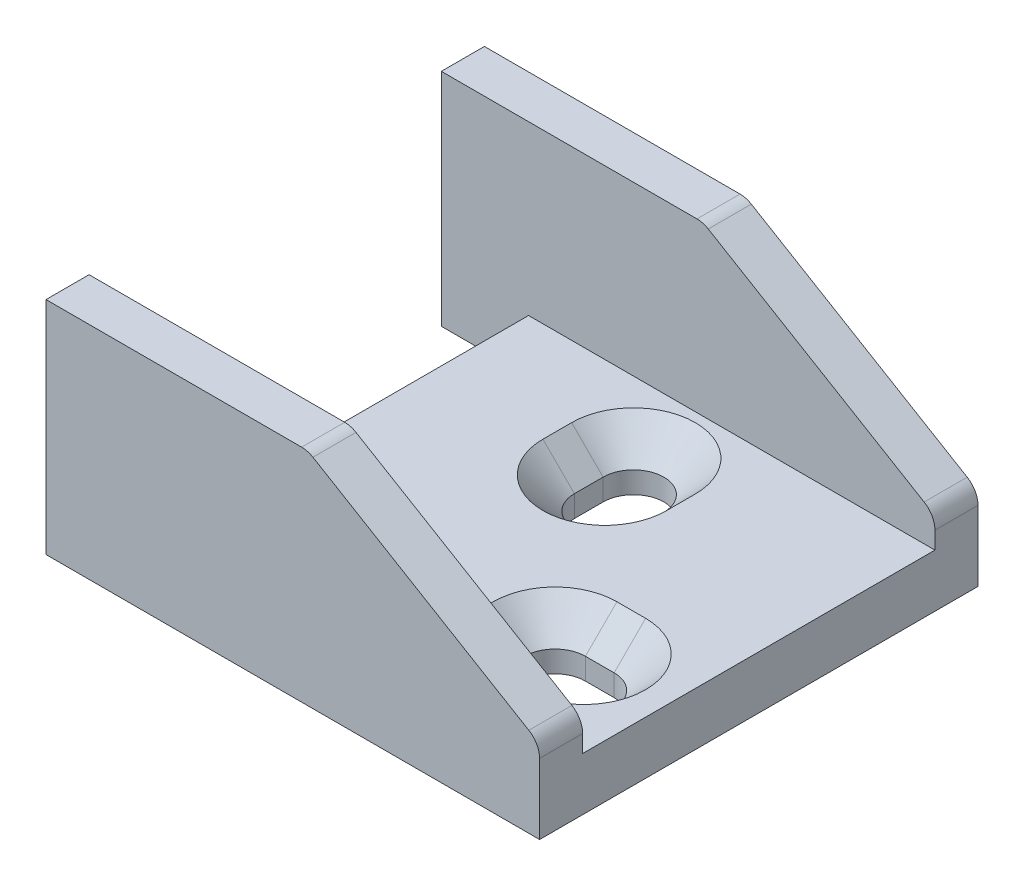
ISO-10303-21;
HEADER;
FILE_DESCRIPTION(('STEP AP214'),'2;1');
FILE_NAME('part.step','',(''),(''),'','','');
FILE_SCHEMA(('AUTOMOTIVE_DESIGN { 1 0 10303 214 1 1 1 1 }'));
ENDSEC;
DATA;
#1=APPLICATION_CONTEXT('core data for automotive mechanical design processes');
#2=APPLICATION_PROTOCOL_DEFINITION('international standard','automotive_design',2000,#1);
#3=PRODUCT_CONTEXT('',#1,'mechanical');
#4=PRODUCT('Part','Part','',(#3));
#5=PRODUCT_RELATED_PRODUCT_CATEGORY('part','',(#4));
#6=PRODUCT_DEFINITION_FORMATION('','',#4);
#7=PRODUCT_DEFINITION_CONTEXT('part definition',#1,'design');
#8=PRODUCT_DEFINITION('design','',#6,#7);
#9=PRODUCT_DEFINITION_SHAPE('','',#8);
#10=(LENGTH_UNIT() NAMED_UNIT(*) SI_UNIT(.MILLI.,.METRE.));
#11=(NAMED_UNIT(*) PLANE_ANGLE_UNIT() SI_UNIT($,.RADIAN.));
#12=(NAMED_UNIT(*) SI_UNIT($,.STERADIAN.) SOLID_ANGLE_UNIT());
#13=UNCERTAINTY_MEASURE_WITH_UNIT(LENGTH_MEASURE(1.E-05),#10,'distance_accuracy_value','');
#14=(GEOMETRIC_REPRESENTATION_CONTEXT(3) GLOBAL_UNCERTAINTY_ASSIGNED_CONTEXT((#13)) GLOBAL_UNIT_ASSIGNED_CONTEXT((#10,
#11,#12)) REPRESENTATION_CONTEXT('',''));
#15=CARTESIAN_POINT('',(0.,0.,0.));
#16=DIRECTION('',(0.,0.,1.));
#17=DIRECTION('',(1.,0.,0.));
#18=AXIS2_PLACEMENT_3D('',#15,#16,#17);
#19=CARTESIAN_POINT('',(0.,4.8,0.));
#20=DIRECTION('',(1.,0.,0.));
#21=DIRECTION('',(0.,0.,-1.));
#22=AXIS2_PLACEMENT_3D('',#19,#20,#21);
#23=PLANE('',#22);
#24=DIRECTION('',(0.,-1.,0.));
#25=VECTOR('',#24,1.);
#26=CARTESIAN_POINT('',(0.,4.8,-3.90000000000002));
#27=LINE('',#26,#25);
#28=CARTESIAN_POINT('',(0.,4.8,-3.90000000000002));
#29=VERTEX_POINT('',#28);
#30=CARTESIAN_POINT('',(0.,0.,-3.9));
#31=VERTEX_POINT('',#30);
#32=EDGE_CURVE('E303',#29,#31,#27,.T.);
#33=ORIENTED_EDGE('',*,*,#32,.F.);
#34=DIRECTION('',(0.,0.,1.));
#35=VECTOR('',#34,1.);
#36=CARTESIAN_POINT('',(0.,4.8,0.));
#37=LINE('',#36,#35);
#38=CARTESIAN_POINT('',(0.,4.8,-35.8));
#39=VERTEX_POINT('',#38);
#40=EDGE_CURVE('E332',#39,#29,#37,.T.);
#41=ORIENTED_EDGE('',*,*,#40,.F.);
#42=DIRECTION('',(0.,1.,0.));
#43=VECTOR('',#42,1.);
#44=CARTESIAN_POINT('',(0.,4.8,-35.8));
#45=LINE('',#44,#43);
#46=CARTESIAN_POINT('',(0.,0.,-35.8));
#47=VERTEX_POINT('',#46);
#48=EDGE_CURVE('E328',#47,#39,#45,.T.);
#49=ORIENTED_EDGE('',*,*,#48,.F.);
#50=DIRECTION('',(0.,0.,1.));
#51=VECTOR('',#50,1.);
#52=CARTESIAN_POINT('',(0.,0.,0.));
#53=LINE('',#52,#51);
#54=EDGE_CURVE('E331',#47,#31,#53,.T.);
#55=ORIENTED_EDGE('',*,*,#54,.T.);
#56=EDGE_LOOP('',(#33,#41,#49,#55));
#57=FACE_BOUND('',#56,.T.);
#58=ADVANCED_FACE('F32',(#57),#23,.F.);
#59=CARTESIAN_POINT('',(0.,4.8,0.));
#60=DIRECTION('',(0.,-1.,0.));
#61=DIRECTION('',(0.,0.,-1.));
#62=AXIS2_PLACEMENT_3D('',#59,#60,#61);
#63=PLANE('',#62);
#64=DIRECTION('',(-1.,0.,0.));
#65=VECTOR('',#64,1.);
#66=CARTESIAN_POINT('',(0.,4.8,-6.14999999999996));
#67=LINE('',#66,#65);
#68=CARTESIAN_POINT('',(29.05,4.8,-6.15));
#69=VERTEX_POINT('',#68);
#70=CARTESIAN_POINT('',(26.45,4.8,-6.15));
#71=VERTEX_POINT('',#70);
#72=EDGE_CURVE('E366',#69,#71,#67,.T.);
#73=ORIENTED_EDGE('',*,*,#72,.T.);
#74=CARTESIAN_POINT('',(26.45,4.8,-11.75));
#75=DIRECTION('',(0.,-1.,0.));
#76=DIRECTION('',(0.,0.,-1.));
#77=AXIS2_PLACEMENT_3D('',#74,#75,#76);
#78=CIRCLE('',#77,5.6);
#79=CARTESIAN_POINT('',(26.45,4.8,-17.35));
#80=VERTEX_POINT('',#79);
#81=EDGE_CURVE('E368',#71,#80,#78,.T.);
#82=ORIENTED_EDGE('',*,*,#81,.T.);
#83=DIRECTION('',(1.,0.,0.));
#84=VECTOR('',#83,1.);
#85=CARTESIAN_POINT('',(0.,4.8,-17.35));
#86=LINE('',#85,#84);
#87=CARTESIAN_POINT('',(29.05,4.8,-17.35));
#88=VERTEX_POINT('',#87);
#89=EDGE_CURVE('E362',#80,#88,#86,.T.);
#90=ORIENTED_EDGE('',*,*,#89,.T.);
#91=CARTESIAN_POINT('',(29.05,4.8,-11.75));
#92=DIRECTION('',(0.,-1.,0.));
#93=DIRECTION('',(0.,0.,-1.));
#94=AXIS2_PLACEMENT_3D('',#91,#92,#93);
#95=CIRCLE('',#94,5.6);
#96=EDGE_CURVE('E364',#88,#69,#95,.T.);
#97=ORIENTED_EDGE('',*,*,#96,.T.);
#98=EDGE_LOOP('',(#73,#82,#90,#97));
#99=FACE_BOUND('',#98,.T.);
#100=CARTESIAN_POINT('',(15.95,4.8,-26.75));
#101=DIRECTION('',(0.,-1.,0.));
#102=DIRECTION('',(0.,0.,-1.));
#103=AXIS2_PLACEMENT_3D('',#100,#101,#102);
#104=CIRCLE('',#103,5.59999999999999);
#105=CARTESIAN_POINT('',(21.55,4.8,-26.75));
#106=VERTEX_POINT('',#105);
#107=CARTESIAN_POINT('',(10.35,4.8,-26.75));
#108=VERTEX_POINT('',#107);
#109=EDGE_CURVE('E357',#106,#108,#104,.T.);
#110=ORIENTED_EDGE('',*,*,#109,.T.);
#111=DIRECTION('',(0.,0.,-1.));
#112=VECTOR('',#111,1.);
#113=CARTESIAN_POINT('',(10.35,4.8,0.));
#114=LINE('',#113,#112);
#115=CARTESIAN_POINT('',(10.35,4.8,-29.35));
#116=VERTEX_POINT('',#115);
#117=EDGE_CURVE('E359',#108,#116,#114,.T.);
#118=ORIENTED_EDGE('',*,*,#117,.T.);
#119=CARTESIAN_POINT('',(15.95,4.8,-29.35));
#120=DIRECTION('',(0.,-1.,0.));
#121=DIRECTION('',(0.,0.,-1.));
#122=AXIS2_PLACEMENT_3D('',#119,#120,#121);
#123=CIRCLE('',#122,5.59999999999999);
#124=CARTESIAN_POINT('',(21.55,4.8,-29.35));
#125=VERTEX_POINT('',#124);
#126=EDGE_CURVE('E353',#116,#125,#123,.T.);
#127=ORIENTED_EDGE('',*,*,#126,.T.);
#128=DIRECTION('',(0.,0.,1.));
#129=VECTOR('',#128,1.);
#130=CARTESIAN_POINT('',(21.55,4.8,0.));
#131=LINE('',#130,#129);
#132=EDGE_CURVE('E355',#125,#106,#131,.T.);
#133=ORIENTED_EDGE('',*,*,#132,.T.);
#134=EDGE_LOOP('',(#110,#118,#127,#133));
#135=FACE_BOUND('',#134,.T.);
#136=DIRECTION('',(-1.,0.,0.));
#137=VECTOR('',#136,1.);
#138=CARTESIAN_POINT('',(0.,4.8,-3.90000000000002));
#139=LINE('',#138,#137);
#140=CARTESIAN_POINT('',(36.8,4.8,-3.89999999999999));
#141=VERTEX_POINT('',#140);
#142=EDGE_CURVE('E300',#141,#29,#139,.T.);
#143=ORIENTED_EDGE('',*,*,#142,.F.);
#144=DIRECTION('',(0.,0.,-1.));
#145=VECTOR('',#144,1.);
#146=CARTESIAN_POINT('',(36.8,4.8,0.));
#147=LINE('',#146,#145);
#148=CARTESIAN_POINT('',(36.8,4.8,-35.8));
#149=VERTEX_POINT('',#148);
#150=EDGE_CURVE('E334',#141,#149,#147,.T.);
#151=ORIENTED_EDGE('',*,*,#150,.T.);
#152=DIRECTION('',(1.,0.,0.));
#153=VECTOR('',#152,1.);
#154=CARTESIAN_POINT('',(0.,4.8,-35.8));
#155=LINE('',#154,#153);
#156=EDGE_CURVE('E325',#39,#149,#155,.T.);
#157=ORIENTED_EDGE('',*,*,#156,.F.);
#158=ORIENTED_EDGE('',*,*,#40,.T.);
#159=EDGE_LOOP('',(#143,#151,#157,#158));
#160=FACE_BOUND('',#159,.T.);
#161=ADVANCED_FACE('F460',(#99,#135,#160),#63,.F.);
#162=CARTESIAN_POINT('',(0.,4.8,0.));
#163=DIRECTION('',(0.,0.,-1.));
#164=DIRECTION('',(-1.,0.,0.));
#165=AXIS2_PLACEMENT_3D('',#162,#163,#164);
#166=PLANE('',#165);
#167=DIRECTION('',(0.,-1.,0.));
#168=VECTOR('',#167,1.);
#169=CARTESIAN_POINT('',(36.8,4.8,0.));
#170=LINE('',#169,#168);
#171=CARTESIAN_POINT('',(36.8,6.36298106479049,0.));
#172=VERTEX_POINT('',#171);
#173=CARTESIAN_POINT('',(36.8,0.,0.));
#174=VERTEX_POINT('',#173);
#175=EDGE_CURVE('E348',#172,#174,#170,.T.);
#176=ORIENTED_EDGE('',*,*,#175,.F.);
#177=CARTESIAN_POINT('',(34.8,6.36298106479049,0.));
#178=DIRECTION('',(0.,0.,-1.));
#179=DIRECTION('',(-1.,0.,0.));
#180=AXIS2_PLACEMENT_3D('',#177,#178,#179);
#181=CIRCLE('',#180,2.);
#182=CARTESIAN_POINT('',(35.8229677195354,8.08156683360991,0.));
#183=VERTEX_POINT('',#182);
#184=EDGE_CURVE('E420',#172,#183,#181,.F.);
#185=ORIENTED_EDGE('',*,*,#184,.T.);
#186=DIRECTION('',(-0.859292884409707,0.511483859767683,0.));
#187=VECTOR('',#186,1.);
#188=CARTESIAN_POINT('',(36.8,7.5,0.));
#189=LINE('',#188,#187);
#190=CARTESIAN_POINT('',(16.2727759083834,19.7185857688194,0.));
#191=VERTEX_POINT('',#190);
#192=EDGE_CURVE('E527',#183,#191,#189,.T.);
#193=ORIENTED_EDGE('',*,*,#192,.T.);
#194=CARTESIAN_POINT('',(15.249808188848,18.,0.));
#195=DIRECTION('',(0.,0.,-1.));
#196=DIRECTION('',(-1.,0.,0.));
#197=AXIS2_PLACEMENT_3D('',#194,#195,#196);
#198=CIRCLE('',#197,2.);
#199=CARTESIAN_POINT('',(15.249808188848,20.,0.));
#200=VERTEX_POINT('',#199);
#201=EDGE_CURVE('E418',#191,#200,#198,.F.);
#202=ORIENTED_EDGE('',*,*,#201,.T.);
#203=DIRECTION('',(1.,0.,0.));
#204=VECTOR('',#203,1.);
#205=CARTESIAN_POINT('',(36.8,20.,0.));
#206=LINE('',#205,#204);
#207=CARTESIAN_POINT('',(-7.90000000000002,20.,0.));
#208=VERTEX_POINT('',#207);
#209=EDGE_CURVE('E281',#208,#200,#206,.T.);
#210=ORIENTED_EDGE('',*,*,#209,.F.);
#211=DIRECTION('',(0.,-1.,0.));
#212=VECTOR('',#211,1.);
#213=CARTESIAN_POINT('',(-7.90000000000002,20.,0.));
#214=LINE('',#213,#212);
#215=CARTESIAN_POINT('',(-7.90000000000002,0.,0.));
#216=VERTEX_POINT('',#215);
#217=EDGE_CURVE('E289',#208,#216,#214,.T.);
#218=ORIENTED_EDGE('',*,*,#217,.T.);
#219=DIRECTION('',(1.,0.,0.));
#220=VECTOR('',#219,1.);
#221=CARTESIAN_POINT('',(0.,0.,0.));
#222=LINE('',#221,#220);
#223=EDGE_CURVE('E340',#216,#174,#222,.T.);
#224=ORIENTED_EDGE('',*,*,#223,.T.);
#225=EDGE_LOOP('',(#176,#185,#193,#202,#210,#218,#224));
#226=FACE_BOUND('',#225,.T.);
#227=ADVANCED_FACE('F466',(#226),#166,.F.);
#228=CARTESIAN_POINT('',(36.8,4.8,0.));
#229=DIRECTION('',(-1.,0.,0.));
#230=DIRECTION('',(0.,0.,1.));
#231=AXIS2_PLACEMENT_3D('',#228,#229,#230);
#232=PLANE('',#231);
#233=DIRECTION('',(0.,-1.,0.));
#234=VECTOR('',#233,1.);
#235=CARTESIAN_POINT('',(36.8,20.,-3.89999999999999));
#236=LINE('',#235,#234);
#237=CARTESIAN_POINT('',(36.8,6.36298106479049,-3.89999999999999));
#238=VERTEX_POINT('',#237);
#239=EDGE_CURVE('E298',#238,#141,#236,.T.);
#240=ORIENTED_EDGE('',*,*,#239,.F.);
#241=DIRECTION('',(0.,0.,-1.));
#242=VECTOR('',#241,1.);
#243=CARTESIAN_POINT('',(36.8,6.36298106479049,0.));
#244=LINE('',#243,#242);
#245=EDGE_CURVE('E416',#238,#172,#244,.F.);
#246=ORIENTED_EDGE('',*,*,#245,.T.);
#247=ORIENTED_EDGE('',*,*,#175,.T.);
#248=DIRECTION('',(0.,0.,-1.));
#249=VECTOR('',#248,1.);
#250=CARTESIAN_POINT('',(36.8,0.,0.));
#251=LINE('',#250,#249);
#252=CARTESIAN_POINT('',(36.8,0.,-39.7));
#253=VERTEX_POINT('',#252);
#254=EDGE_CURVE('E343',#174,#253,#251,.T.);
#255=ORIENTED_EDGE('',*,*,#254,.T.);
#256=DIRECTION('',(0.,-1.,0.));
#257=VECTOR('',#256,1.);
#258=CARTESIAN_POINT('',(36.8,4.8,-39.7));
#259=LINE('',#258,#257);
#260=CARTESIAN_POINT('',(36.8,6.36298106479049,-39.7));
#261=VERTEX_POINT('',#260);
#262=EDGE_CURVE('E338',#261,#253,#259,.T.);
#263=ORIENTED_EDGE('',*,*,#262,.F.);
#264=DIRECTION('',(0.,0.,-1.));
#265=VECTOR('',#264,1.);
#266=CARTESIAN_POINT('',(36.8,6.36298106479049,0.));
#267=LINE('',#266,#265);
#268=CARTESIAN_POINT('',(36.8,6.36298106479049,-35.8));
#269=VERTEX_POINT('',#268);
#270=EDGE_CURVE('E414',#261,#269,#267,.F.);
#271=ORIENTED_EDGE('',*,*,#270,.T.);
#272=DIRECTION('',(0.,-1.,0.));
#273=VECTOR('',#272,1.);
#274=CARTESIAN_POINT('',(36.8,20.,-35.8));
#275=LINE('',#274,#273);
#276=EDGE_CURVE('E314',#269,#149,#275,.T.);
#277=ORIENTED_EDGE('',*,*,#276,.T.);
#278=ORIENTED_EDGE('',*,*,#150,.F.);
#279=EDGE_LOOP('',(#240,#246,#247,#255,#263,#271,#277,#278));
#280=FACE_BOUND('',#279,.T.);
#281=ADVANCED_FACE('F553',(#280),#232,.F.);
#282=CARTESIAN_POINT('',(0.,4.8,-39.7));
#283=DIRECTION('',(0.,0.,1.));
#284=DIRECTION('',(1.,0.,0.));
#285=AXIS2_PLACEMENT_3D('',#282,#283,#284);
#286=PLANE('',#285);
#287=DIRECTION('',(-0.859292884409707,0.511483859767683,0.));
#288=VECTOR('',#287,1.);
#289=CARTESIAN_POINT('',(36.8,7.5,-39.7));
#290=LINE('',#289,#288);
#291=CARTESIAN_POINT('',(35.8229677195354,8.08156683360991,-39.7));
#292=VERTEX_POINT('',#291);
#293=CARTESIAN_POINT('',(16.2727759083834,19.7185857688194,-39.7));
#294=VERTEX_POINT('',#293);
#295=EDGE_CURVE('E523',#292,#294,#290,.T.);
#296=ORIENTED_EDGE('',*,*,#295,.F.);
#297=CARTESIAN_POINT('',(34.8,6.36298106479049,-39.7));
#298=DIRECTION('',(0.,0.,1.));
#299=DIRECTION('',(1.,0.,0.));
#300=AXIS2_PLACEMENT_3D('',#297,#298,#299);
#301=CIRCLE('',#300,2.);
#302=EDGE_CURVE('E428',#292,#261,#301,.F.);
#303=ORIENTED_EDGE('',*,*,#302,.T.);
#304=ORIENTED_EDGE('',*,*,#262,.T.);
#305=DIRECTION('',(-1.,0.,0.));
#306=VECTOR('',#305,1.);
#307=CARTESIAN_POINT('',(0.,0.,-39.7));
#308=LINE('',#307,#306);
#309=CARTESIAN_POINT('',(-7.9,0.,-39.7));
#310=VERTEX_POINT('',#309);
#311=EDGE_CURVE('E335',#253,#310,#308,.T.);
#312=ORIENTED_EDGE('',*,*,#311,.T.);
#313=DIRECTION('',(0.,-1.,0.));
#314=VECTOR('',#313,1.);
#315=CARTESIAN_POINT('',(-7.9,20.,-39.7));
#316=LINE('',#315,#314);
#317=CARTESIAN_POINT('',(-7.9,20.,-39.7));
#318=VERTEX_POINT('',#317);
#319=EDGE_CURVE('E322',#318,#310,#316,.T.);
#320=ORIENTED_EDGE('',*,*,#319,.F.);
#321=DIRECTION('',(-1.,0.,0.));
#322=VECTOR('',#321,1.);
#323=CARTESIAN_POINT('',(36.8,20.,-39.7));
#324=LINE('',#323,#322);
#325=CARTESIAN_POINT('',(15.249808188848,20.,-39.7));
#326=VERTEX_POINT('',#325);
#327=EDGE_CURVE('E307',#326,#318,#324,.T.);
#328=ORIENTED_EDGE('',*,*,#327,.F.);
#329=CARTESIAN_POINT('',(15.249808188848,18.,-39.7));
#330=DIRECTION('',(0.,0.,1.));
#331=DIRECTION('',(1.,0.,0.));
#332=AXIS2_PLACEMENT_3D('',#329,#330,#331);
#333=CIRCLE('',#332,2.);
#334=EDGE_CURVE('E55',#326,#294,#333,.F.);
#335=ORIENTED_EDGE('',*,*,#334,.T.);
#336=EDGE_LOOP('',(#296,#303,#304,#312,#320,#328,#335));
#337=FACE_BOUND('',#336,.T.);
#338=ADVANCED_FACE('F438',(#337),#286,.F.);
#339=CARTESIAN_POINT('',(0.,0.,0.));
#340=DIRECTION('',(0.,-1.,0.));
#341=DIRECTION('',(0.,0.,-1.));
#342=AXIS2_PLACEMENT_3D('',#339,#340,#341);
#343=PLANE('',#342);
#344=CARTESIAN_POINT('',(15.95,0.,-29.35));
#345=DIRECTION('',(0.,-1.,0.));
#346=DIRECTION('',(0.,0.,-1.));
#347=AXIS2_PLACEMENT_3D('',#344,#345,#346);
#348=CIRCLE('',#347,2.75);
#349=CARTESIAN_POINT('',(18.7,0.,-29.35));
#350=VERTEX_POINT('',#349);
#351=CARTESIAN_POINT('',(13.2,0.,-29.35));
#352=VERTEX_POINT('',#351);
#353=EDGE_CURVE('E238',#350,#352,#348,.F.);
#354=ORIENTED_EDGE('',*,*,#353,.T.);
#355=DIRECTION('',(0.,0.,1.));
#356=VECTOR('',#355,1.);
#357=CARTESIAN_POINT('',(13.2,0.,-29.35));
#358=LINE('',#357,#356);
#359=CARTESIAN_POINT('',(13.2,0.,-26.75));
#360=VERTEX_POINT('',#359);
#361=EDGE_CURVE('E220',#352,#360,#358,.T.);
#362=ORIENTED_EDGE('',*,*,#361,.T.);
#363=CARTESIAN_POINT('',(15.95,0.,-26.75));
#364=DIRECTION('',(0.,-1.,0.));
#365=DIRECTION('',(0.,0.,-1.));
#366=AXIS2_PLACEMENT_3D('',#363,#364,#365);
#367=CIRCLE('',#366,2.75);
#368=CARTESIAN_POINT('',(18.7,0.,-26.75));
#369=VERTEX_POINT('',#368);
#370=EDGE_CURVE('E248',#360,#369,#367,.F.);
#371=ORIENTED_EDGE('',*,*,#370,.T.);
#372=DIRECTION('',(0.,0.,-1.));
#373=VECTOR('',#372,1.);
#374=CARTESIAN_POINT('',(18.7,0.,-29.35));
#375=LINE('',#374,#373);
#376=EDGE_CURVE('E246',#369,#350,#375,.T.);
#377=ORIENTED_EDGE('',*,*,#376,.T.);
#378=EDGE_LOOP('',(#354,#362,#371,#377));
#379=FACE_BOUND('',#378,.T.);
#380=CARTESIAN_POINT('',(26.45,0.,-11.75));
#381=DIRECTION('',(0.,-1.,0.));
#382=DIRECTION('',(0.,0.,-1.));
#383=AXIS2_PLACEMENT_3D('',#380,#381,#382);
#384=CIRCLE('',#383,2.75);
#385=CARTESIAN_POINT('',(26.45,0.,-14.5));
#386=VERTEX_POINT('',#385);
#387=CARTESIAN_POINT('',(26.45,0.,-9.));
#388=VERTEX_POINT('',#387);
#389=EDGE_CURVE('E262',#386,#388,#384,.F.);
#390=ORIENTED_EDGE('',*,*,#389,.T.);
#391=DIRECTION('',(1.,0.,0.));
#392=VECTOR('',#391,1.);
#393=CARTESIAN_POINT('',(26.45,0.,-9.));
#394=LINE('',#393,#392);
#395=CARTESIAN_POINT('',(29.05,0.,-9.));
#396=VERTEX_POINT('',#395);
#397=EDGE_CURVE('E269',#388,#396,#394,.T.);
#398=ORIENTED_EDGE('',*,*,#397,.T.);
#399=CARTESIAN_POINT('',(29.05,0.,-11.75));
#400=DIRECTION('',(0.,-1.,0.));
#401=DIRECTION('',(0.,0.,-1.));
#402=AXIS2_PLACEMENT_3D('',#399,#400,#401);
#403=CIRCLE('',#402,2.75);
#404=CARTESIAN_POINT('',(29.05,0.,-14.5));
#405=VERTEX_POINT('',#404);
#406=EDGE_CURVE('E232',#396,#405,#403,.F.);
#407=ORIENTED_EDGE('',*,*,#406,.T.);
#408=DIRECTION('',(-1.,0.,0.));
#409=VECTOR('',#408,1.);
#410=CARTESIAN_POINT('',(26.45,0.,-14.5));
#411=LINE('',#410,#409);
#412=EDGE_CURVE('E259',#405,#386,#411,.T.);
#413=ORIENTED_EDGE('',*,*,#412,.T.);
#414=EDGE_LOOP('',(#390,#398,#407,#413));
#415=FACE_BOUND('',#414,.T.);
#416=ORIENTED_EDGE('',*,*,#223,.F.);
#417=DIRECTION('',(0.,0.,1.));
#418=VECTOR('',#417,1.);
#419=CARTESIAN_POINT('',(-7.90000000000002,0.,0.));
#420=LINE('',#419,#418);
#421=CARTESIAN_POINT('',(-7.90000000000002,0.,-3.90000000000002));
#422=VERTEX_POINT('',#421);
#423=EDGE_CURVE('E285',#422,#216,#420,.T.);
#424=ORIENTED_EDGE('',*,*,#423,.F.);
#425=DIRECTION('',(-1.,0.,0.));
#426=VECTOR('',#425,1.);
#427=CARTESIAN_POINT('',(36.8,0.,-3.89999999999999));
#428=LINE('',#427,#426);
#429=EDGE_CURVE('E280',#31,#422,#428,.T.);
#430=ORIENTED_EDGE('',*,*,#429,.F.);
#431=ORIENTED_EDGE('',*,*,#54,.F.);
#432=DIRECTION('',(1.,0.,0.));
#433=VECTOR('',#432,1.);
#434=CARTESIAN_POINT('',(36.8,0.,-35.8));
#435=LINE('',#434,#433);
#436=CARTESIAN_POINT('',(-7.9,0.,-35.8));
#437=VERTEX_POINT('',#436);
#438=EDGE_CURVE('E310',#437,#47,#435,.T.);
#439=ORIENTED_EDGE('',*,*,#438,.F.);
#440=DIRECTION('',(0.,0.,1.));
#441=VECTOR('',#440,1.);
#442=CARTESIAN_POINT('',(-7.9,0.,-39.7));
#443=LINE('',#442,#441);
#444=EDGE_CURVE('E306',#310,#437,#443,.T.);
#445=ORIENTED_EDGE('',*,*,#444,.F.);
#446=ORIENTED_EDGE('',*,*,#311,.F.);
#447=ORIENTED_EDGE('',*,*,#254,.F.);
#448=EDGE_LOOP('',(#416,#424,#430,#431,#439,#445,#446,#447));
#449=FACE_BOUND('',#448,.T.);
#450=ADVANCED_FACE('F244',(#379,#415,#449),#343,.T.);
#451=CARTESIAN_POINT('',(36.8,20.,-35.8));
#452=DIRECTION('',(0.,0.,-1.));
#453=DIRECTION('',(-1.,0.,0.));
#454=AXIS2_PLACEMENT_3D('',#451,#452,#453);
#455=PLANE('',#454);
#456=ORIENTED_EDGE('',*,*,#276,.F.);
#457=CARTESIAN_POINT('',(34.8,6.36298106479049,-35.8));
#458=DIRECTION('',(0.,0.,-1.));
#459=DIRECTION('',(-1.,0.,0.));
#460=AXIS2_PLACEMENT_3D('',#457,#458,#459);
#461=CIRCLE('',#460,2.);
#462=CARTESIAN_POINT('',(35.8229677195354,8.0815668336099,-35.8));
#463=VERTEX_POINT('',#462);
#464=EDGE_CURVE('E431',#269,#463,#461,.F.);
#465=ORIENTED_EDGE('',*,*,#464,.T.);
#466=DIRECTION('',(-0.859292884409707,0.511483859767683,0.));
#467=VECTOR('',#466,1.);
#468=CARTESIAN_POINT('',(31.3060694851402,10.7701967350356,-35.8));
#469=LINE('',#468,#467);
#470=CARTESIAN_POINT('',(16.2727759083834,19.7185857688194,-35.8));
#471=VERTEX_POINT('',#470);
#472=EDGE_CURVE('E399',#463,#471,#469,.T.);
#473=ORIENTED_EDGE('',*,*,#472,.T.);
#474=CARTESIAN_POINT('',(15.249808188848,18.,-35.8));
#475=DIRECTION('',(0.,0.,-1.));
#476=DIRECTION('',(-1.,0.,0.));
#477=AXIS2_PLACEMENT_3D('',#474,#475,#476);
#478=CIRCLE('',#477,2.);
#479=CARTESIAN_POINT('',(15.249808188848,20.,-35.8));
#480=VERTEX_POINT('',#479);
#481=EDGE_CURVE('E47',#471,#480,#478,.F.);
#482=ORIENTED_EDGE('',*,*,#481,.T.);
#483=DIRECTION('',(1.,0.,0.));
#484=VECTOR('',#483,1.);
#485=CARTESIAN_POINT('',(36.8,20.,-35.8));
#486=LINE('',#485,#484);
#487=CARTESIAN_POINT('',(-7.9,20.,-35.8));
#488=VERTEX_POINT('',#487);
#489=EDGE_CURVE('E312',#488,#480,#486,.T.);
#490=ORIENTED_EDGE('',*,*,#489,.F.);
#491=DIRECTION('',(0.,-1.,0.));
#492=VECTOR('',#491,1.);
#493=CARTESIAN_POINT('',(-7.9,20.,-35.8));
#494=LINE('',#493,#492);
#495=EDGE_CURVE('E319',#488,#437,#494,.T.);
#496=ORIENTED_EDGE('',*,*,#495,.T.);
#497=ORIENTED_EDGE('',*,*,#438,.T.);
#498=ORIENTED_EDGE('',*,*,#48,.T.);
#499=ORIENTED_EDGE('',*,*,#156,.T.);
#500=EDGE_LOOP('',(#456,#465,#473,#482,#490,#496,#497,#498,#499));
#501=FACE_BOUND('',#500,.T.);
#502=ADVANCED_FACE('F448',(#501),#455,.F.);
#503=CARTESIAN_POINT('',(-7.9,20.,-39.7));
#504=DIRECTION('',(1.,0.,0.));
#505=DIRECTION('',(0.,0.,-1.));
#506=AXIS2_PLACEMENT_3D('',#503,#504,#505);
#507=PLANE('',#506);
#508=ORIENTED_EDGE('',*,*,#444,.T.);
#509=ORIENTED_EDGE('',*,*,#495,.F.);
#510=DIRECTION('',(0.,0.,1.));
#511=VECTOR('',#510,1.);
#512=CARTESIAN_POINT('',(-7.9,20.,-39.7));
#513=LINE('',#512,#511);
#514=EDGE_CURVE('E309',#318,#488,#513,.T.);
#515=ORIENTED_EDGE('',*,*,#514,.F.);
#516=ORIENTED_EDGE('',*,*,#319,.T.);
#517=EDGE_LOOP('',(#508,#509,#515,#516));
#518=FACE_BOUND('',#517,.T.);
#519=ADVANCED_FACE('F445',(#518),#507,.F.);
#520=CARTESIAN_POINT('',(0.,20.,0.));
#521=DIRECTION('',(0.,-1.,0.));
#522=DIRECTION('',(0.,0.,-1.));
#523=AXIS2_PLACEMENT_3D('',#520,#521,#522);
#524=PLANE('',#523);
#525=ORIENTED_EDGE('',*,*,#489,.T.);
#526=DIRECTION('',(0.,0.,-1.));
#527=VECTOR('',#526,1.);
#528=CARTESIAN_POINT('',(15.249808188848,20.,0.));
#529=LINE('',#528,#527);
#530=EDGE_CURVE('E40',#480,#326,#529,.T.);
#531=ORIENTED_EDGE('',*,*,#530,.T.);
#532=ORIENTED_EDGE('',*,*,#327,.T.);
#533=ORIENTED_EDGE('',*,*,#514,.T.);
#534=EDGE_LOOP('',(#525,#531,#532,#533));
#535=FACE_BOUND('',#534,.T.);
#536=ADVANCED_FACE('F434',(#535),#524,.F.);
#537=CARTESIAN_POINT('',(36.8,20.,-3.89999999999999));
#538=DIRECTION('',(0.,0.,1.));
#539=DIRECTION('',(1.,0.,0.));
#540=AXIS2_PLACEMENT_3D('',#537,#538,#539);
#541=PLANE('',#540);
#542=DIRECTION('',(0.859292884409707,-0.511483859767683,0.));
#543=VECTOR('',#542,1.);
#544=CARTESIAN_POINT('',(31.3060694851402,10.7701967350356,-3.89999999999999));
#545=LINE('',#544,#543);
#546=CARTESIAN_POINT('',(16.2727759083834,19.7185857688194,-3.9));
#547=VERTEX_POINT('',#546);
#548=CARTESIAN_POINT('',(35.8229677195354,8.0815668336099,-3.89999999999999));
#549=VERTEX_POINT('',#548);
#550=EDGE_CURVE('E524',#547,#549,#545,.T.);
#551=ORIENTED_EDGE('',*,*,#550,.T.);
#552=CARTESIAN_POINT('',(34.8,6.36298106479049,-3.89999999999999));
#553=DIRECTION('',(0.,0.,1.));
#554=DIRECTION('',(1.,0.,0.));
#555=AXIS2_PLACEMENT_3D('',#552,#553,#554);
#556=CIRCLE('',#555,2.);
#557=EDGE_CURVE('E412',#549,#238,#556,.F.);
#558=ORIENTED_EDGE('',*,*,#557,.T.);
#559=ORIENTED_EDGE('',*,*,#239,.T.);
#560=ORIENTED_EDGE('',*,*,#142,.T.);
#561=ORIENTED_EDGE('',*,*,#32,.T.);
#562=ORIENTED_EDGE('',*,*,#429,.T.);
#563=DIRECTION('',(0.,-1.,0.));
#564=VECTOR('',#563,1.);
#565=CARTESIAN_POINT('',(-7.90000000000002,20.,-3.90000000000002));
#566=LINE('',#565,#564);
#567=CARTESIAN_POINT('',(-7.90000000000002,20.,-3.90000000000002));
#568=VERTEX_POINT('',#567);
#569=EDGE_CURVE('E295',#568,#422,#566,.T.);
#570=ORIENTED_EDGE('',*,*,#569,.F.);
#571=DIRECTION('',(-1.,0.,0.));
#572=VECTOR('',#571,1.);
#573=CARTESIAN_POINT('',(36.8,20.,-3.89999999999999));
#574=LINE('',#573,#572);
#575=CARTESIAN_POINT('',(15.249808188848,20.,-3.9));
#576=VERTEX_POINT('',#575);
#577=EDGE_CURVE('E284',#576,#568,#574,.T.);
#578=ORIENTED_EDGE('',*,*,#577,.F.);
#579=CARTESIAN_POINT('',(15.249808188848,18.,-3.9));
#580=DIRECTION('',(0.,0.,1.));
#581=DIRECTION('',(1.,0.,0.));
#582=AXIS2_PLACEMENT_3D('',#579,#580,#581);
#583=CIRCLE('',#582,2.);
#584=EDGE_CURVE('E410',#576,#547,#583,.F.);
#585=ORIENTED_EDGE('',*,*,#584,.T.);
#586=EDGE_LOOP('',(#551,#558,#559,#560,#561,#562,#570,#578,#585));
#587=FACE_BOUND('',#586,.T.);
#588=ADVANCED_FACE('F573',(#587),#541,.F.);
#589=CARTESIAN_POINT('',(-7.90000000000002,20.,0.));
#590=DIRECTION('',(1.,0.,0.));
#591=DIRECTION('',(0.,0.,-1.));
#592=AXIS2_PLACEMENT_3D('',#589,#590,#591);
#593=PLANE('',#592);
#594=ORIENTED_EDGE('',*,*,#423,.T.);
#595=ORIENTED_EDGE('',*,*,#217,.F.);
#596=DIRECTION('',(0.,0.,1.));
#597=VECTOR('',#596,1.);
#598=CARTESIAN_POINT('',(-7.90000000000002,20.,0.));
#599=LINE('',#598,#597);
#600=EDGE_CURVE('E287',#568,#208,#599,.T.);
#601=ORIENTED_EDGE('',*,*,#600,.F.);
#602=ORIENTED_EDGE('',*,*,#569,.T.);
#603=EDGE_LOOP('',(#594,#595,#601,#602));
#604=FACE_BOUND('',#603,.T.);
#605=ADVANCED_FACE('F580',(#604),#593,.F.);
#606=CARTESIAN_POINT('',(0.,20.,0.));
#607=DIRECTION('',(0.,-1.,0.));
#608=DIRECTION('',(0.,0.,-1.));
#609=AXIS2_PLACEMENT_3D('',#606,#607,#608);
#610=PLANE('',#609);
#611=ORIENTED_EDGE('',*,*,#209,.T.);
#612=DIRECTION('',(0.,0.,-1.));
#613=VECTOR('',#612,1.);
#614=CARTESIAN_POINT('',(15.249808188848,20.,0.));
#615=LINE('',#614,#613);
#616=EDGE_CURVE('E11',#200,#576,#615,.T.);
#617=ORIENTED_EDGE('',*,*,#616,.T.);
#618=ORIENTED_EDGE('',*,*,#577,.T.);
#619=ORIENTED_EDGE('',*,*,#600,.T.);
#620=EDGE_LOOP('',(#611,#617,#618,#619));
#621=FACE_BOUND('',#620,.T.);
#622=ADVANCED_FACE('F571',(#621),#610,.F.);
#623=CARTESIAN_POINT('',(26.45,-0.00100000000000013,-11.75));
#624=DIRECTION('',(0.,1.,0.));
#625=DIRECTION('',(0.,0.,1.));
#626=AXIS2_PLACEMENT_3D('',#623,#624,#625);
#627=CYLINDRICAL_SURFACE('',#626,2.75);
#628=DIRECTION('',(0.,1.,0.));
#629=VECTOR('',#628,1.);
#630=CARTESIAN_POINT('',(26.45,-0.00100000000000013,-14.5));
#631=LINE('',#630,#629);
#632=CARTESIAN_POINT('',(26.45,1.95000000000001,-14.5));
#633=VERTEX_POINT('',#632);
#634=EDGE_CURVE('E266',#386,#633,#631,.T.);
#635=ORIENTED_EDGE('',*,*,#634,.T.);
#636=CARTESIAN_POINT('',(26.45,1.95000000000001,-11.75));
#637=DIRECTION('',(0.,-1.,0.));
#638=DIRECTION('',(0.,0.,-1.));
#639=AXIS2_PLACEMENT_3D('',#636,#637,#638);
#640=CIRCLE('',#639,2.75);
#641=CARTESIAN_POINT('',(26.45,1.95000000000001,-9.));
#642=VERTEX_POINT('',#641);
#643=EDGE_CURVE('E350',#633,#642,#640,.F.);
#644=ORIENTED_EDGE('',*,*,#643,.T.);
#645=DIRECTION('',(0.,1.,0.));
#646=VECTOR('',#645,1.);
#647=CARTESIAN_POINT('',(26.45,-0.00100000000000013,-9.));
#648=LINE('',#647,#646);
#649=EDGE_CURVE('E265',#388,#642,#648,.T.);
#650=ORIENTED_EDGE('',*,*,#649,.F.);
#651=ORIENTED_EDGE('',*,*,#389,.F.);
#652=EDGE_LOOP('',(#635,#644,#650,#651));
#653=FACE_BOUND('',#652,.T.);
#654=ADVANCED_FACE('F602',(#653),#627,.F.);
#655=CARTESIAN_POINT('',(26.45,-0.00100000000000013,-14.5));
#656=DIRECTION('',(0.,0.,-1.));
#657=DIRECTION('',(-1.,0.,0.));
#658=AXIS2_PLACEMENT_3D('',#655,#656,#657);
#659=PLANE('',#658);
#660=DIRECTION('',(0.,1.,0.));
#661=VECTOR('',#660,1.);
#662=CARTESIAN_POINT('',(29.05,-0.00100000000000013,-14.5));
#663=LINE('',#662,#661);
#664=CARTESIAN_POINT('',(29.05,1.95000000000001,-14.5));
#665=VERTEX_POINT('',#664);
#666=EDGE_CURVE('E270',#405,#665,#663,.T.);
#667=ORIENTED_EDGE('',*,*,#666,.T.);
#668=DIRECTION('',(-1.,0.,0.));
#669=VECTOR('',#668,1.);
#670=CARTESIAN_POINT('',(26.45,1.95000000000001,-14.5));
#671=LINE('',#670,#669);
#672=EDGE_CURVE('E375',#665,#633,#671,.T.);
#673=ORIENTED_EDGE('',*,*,#672,.T.);
#674=ORIENTED_EDGE('',*,*,#634,.F.);
#675=ORIENTED_EDGE('',*,*,#412,.F.);
#676=EDGE_LOOP('',(#667,#673,#674,#675));
#677=FACE_BOUND('',#676,.T.);
#678=ADVANCED_FACE('F598',(#677),#659,.F.);
#679=CARTESIAN_POINT('',(29.05,-0.00100000000000013,-11.75));
#680=DIRECTION('',(0.,1.,0.));
#681=DIRECTION('',(0.,0.,1.));
#682=AXIS2_PLACEMENT_3D('',#679,#680,#681);
#683=CYLINDRICAL_SURFACE('',#682,2.75);
#684=DIRECTION('',(0.,1.,0.));
#685=VECTOR('',#684,1.);
#686=CARTESIAN_POINT('',(29.05,-0.00100000000000013,-9.));
#687=LINE('',#686,#685);
#688=CARTESIAN_POINT('',(29.05,1.95000000000001,-9.));
#689=VERTEX_POINT('',#688);
#690=EDGE_CURVE('E273',#396,#689,#687,.T.);
#691=ORIENTED_EDGE('',*,*,#690,.T.);
#692=CARTESIAN_POINT('',(29.05,1.95000000000001,-11.75));
#693=DIRECTION('',(0.,-1.,0.));
#694=DIRECTION('',(0.,0.,-1.));
#695=AXIS2_PLACEMENT_3D('',#692,#693,#694);
#696=CIRCLE('',#695,2.75);
#697=EDGE_CURVE('E373',#689,#665,#696,.F.);
#698=ORIENTED_EDGE('',*,*,#697,.T.);
#699=ORIENTED_EDGE('',*,*,#666,.F.);
#700=ORIENTED_EDGE('',*,*,#406,.F.);
#701=EDGE_LOOP('',(#691,#698,#699,#700));
#702=FACE_BOUND('',#701,.T.);
#703=ADVANCED_FACE('F601',(#702),#683,.F.);
#704=CARTESIAN_POINT('',(26.45,-0.00100000000000013,-9.));
#705=DIRECTION('',(0.,0.,1.));
#706=DIRECTION('',(1.,0.,0.));
#707=AXIS2_PLACEMENT_3D('',#704,#705,#706);
#708=PLANE('',#707);
#709=ORIENTED_EDGE('',*,*,#649,.T.);
#710=DIRECTION('',(1.,0.,0.));
#711=VECTOR('',#710,1.);
#712=CARTESIAN_POINT('',(26.45,1.95000000000001,-9.));
#713=LINE('',#712,#711);
#714=EDGE_CURVE('E371',#642,#689,#713,.T.);
#715=ORIENTED_EDGE('',*,*,#714,.T.);
#716=ORIENTED_EDGE('',*,*,#690,.F.);
#717=ORIENTED_EDGE('',*,*,#397,.F.);
#718=EDGE_LOOP('',(#709,#715,#716,#717));
#719=FACE_BOUND('',#718,.T.);
#720=ADVANCED_FACE('F597',(#719),#708,.F.);
#721=CARTESIAN_POINT('',(15.95,-0.00100000000000013,-29.35));
#722=DIRECTION('',(0.,1.,0.));
#723=DIRECTION('',(0.,0.,1.));
#724=AXIS2_PLACEMENT_3D('',#721,#722,#723);
#725=CYLINDRICAL_SURFACE('',#724,2.75);
#726=DIRECTION('',(0.,1.,0.));
#727=VECTOR('',#726,1.);
#728=CARTESIAN_POINT('',(18.7,-0.00100000000000013,-29.35));
#729=LINE('',#728,#727);
#730=CARTESIAN_POINT('',(18.7,1.95000000000003,-29.35));
#731=VERTEX_POINT('',#730);
#732=EDGE_CURVE('E233',#350,#731,#729,.T.);
#733=ORIENTED_EDGE('',*,*,#732,.T.);
#734=CARTESIAN_POINT('',(15.95,1.95000000000003,-29.35));
#735=DIRECTION('',(0.,-1.,0.));
#736=DIRECTION('',(0.,0.,-1.));
#737=AXIS2_PLACEMENT_3D('',#734,#735,#736);
#738=CIRCLE('',#737,2.75);
#739=CARTESIAN_POINT('',(13.2,1.95000000000003,-29.35));
#740=VERTEX_POINT('',#739);
#741=EDGE_CURVE('E241',#731,#740,#738,.F.);
#742=ORIENTED_EDGE('',*,*,#741,.T.);
#743=DIRECTION('',(0.,1.,0.));
#744=VECTOR('',#743,1.);
#745=CARTESIAN_POINT('',(13.2,-0.00100000000000013,-29.35));
#746=LINE('',#745,#744);
#747=EDGE_CURVE('E224',#352,#740,#746,.T.);
#748=ORIENTED_EDGE('',*,*,#747,.F.);
#749=ORIENTED_EDGE('',*,*,#353,.F.);
#750=EDGE_LOOP('',(#733,#742,#748,#749));
#751=FACE_BOUND('',#750,.T.);
#752=ADVANCED_FACE('F237',(#751),#725,.F.);
#753=CARTESIAN_POINT('',(18.7,-0.00100000000000013,-29.35));
#754=DIRECTION('',(1.,0.,0.));
#755=DIRECTION('',(0.,0.,-1.));
#756=AXIS2_PLACEMENT_3D('',#753,#754,#755);
#757=PLANE('',#756);
#758=DIRECTION('',(0.,1.,0.));
#759=VECTOR('',#758,1.);
#760=CARTESIAN_POINT('',(18.7,-0.00100000000000013,-26.75));
#761=LINE('',#760,#759);
#762=CARTESIAN_POINT('',(18.7,1.95000000000003,-26.75));
#763=VERTEX_POINT('',#762);
#764=EDGE_CURVE('E253',#369,#763,#761,.T.);
#765=ORIENTED_EDGE('',*,*,#764,.T.);
#766=DIRECTION('',(0.,0.,-1.));
#767=VECTOR('',#766,1.);
#768=CARTESIAN_POINT('',(18.7,1.95000000000003,-29.35));
#769=LINE('',#768,#767);
#770=EDGE_CURVE('E381',#763,#731,#769,.T.);
#771=ORIENTED_EDGE('',*,*,#770,.T.);
#772=ORIENTED_EDGE('',*,*,#732,.F.);
#773=ORIENTED_EDGE('',*,*,#376,.F.);
#774=EDGE_LOOP('',(#765,#771,#772,#773));
#775=FACE_BOUND('',#774,.T.);
#776=ADVANCED_FACE('F536',(#775),#757,.F.);
#777=CARTESIAN_POINT('',(15.95,-0.00100000000000013,-26.75));
#778=DIRECTION('',(0.,1.,0.));
#779=DIRECTION('',(0.,0.,1.));
#780=AXIS2_PLACEMENT_3D('',#777,#778,#779);
#781=CYLINDRICAL_SURFACE('',#780,2.75);
#782=DIRECTION('',(0.,1.,0.));
#783=VECTOR('',#782,1.);
#784=CARTESIAN_POINT('',(13.2,-0.00100000000000013,-26.75));
#785=LINE('',#784,#783);
#786=CARTESIAN_POINT('',(13.2,1.95000000000003,-26.75));
#787=VERTEX_POINT('',#786);
#788=EDGE_CURVE('E227',#360,#787,#785,.T.);
#789=ORIENTED_EDGE('',*,*,#788,.T.);
#790=CARTESIAN_POINT('',(15.95,1.95000000000003,-26.75));
#791=DIRECTION('',(0.,-1.,0.));
#792=DIRECTION('',(0.,0.,-1.));
#793=AXIS2_PLACEMENT_3D('',#790,#791,#792);
#794=CIRCLE('',#793,2.75);
#795=EDGE_CURVE('E379',#787,#763,#794,.F.);
#796=ORIENTED_EDGE('',*,*,#795,.T.);
#797=ORIENTED_EDGE('',*,*,#764,.F.);
#798=ORIENTED_EDGE('',*,*,#370,.F.);
#799=EDGE_LOOP('',(#789,#796,#797,#798));
#800=FACE_BOUND('',#799,.T.);
#801=ADVANCED_FACE('F532',(#800),#781,.F.);
#802=CARTESIAN_POINT('',(13.2,-0.00100000000000013,-29.35));
#803=DIRECTION('',(-1.,0.,0.));
#804=DIRECTION('',(0.,0.,1.));
#805=AXIS2_PLACEMENT_3D('',#802,#803,#804);
#806=PLANE('',#805);
#807=ORIENTED_EDGE('',*,*,#747,.T.);
#808=DIRECTION('',(0.,0.,1.));
#809=VECTOR('',#808,1.);
#810=CARTESIAN_POINT('',(13.2,1.95000000000003,-29.35));
#811=LINE('',#810,#809);
#812=EDGE_CURVE('E377',#740,#787,#811,.T.);
#813=ORIENTED_EDGE('',*,*,#812,.T.);
#814=ORIENTED_EDGE('',*,*,#788,.F.);
#815=ORIENTED_EDGE('',*,*,#361,.F.);
#816=EDGE_LOOP('',(#807,#813,#814,#815));
#817=FACE_BOUND('',#816,.T.);
#818=ADVANCED_FACE('F222',(#817),#806,.F.);
#819=CARTESIAN_POINT('',(29.05,1.95000000000001,-11.75));
#820=DIRECTION('',(0.,1.,0.));
#821=DIRECTION('',(0.,0.,1.));
#822=AXIS2_PLACEMENT_3D('',#819,#820,#821);
#823=CONICAL_SURFACE('',#822,2.75,0.78539816339745);
#824=DIRECTION('',(0.,-0.707106781186547,-0.707106781186548));
#825=VECTOR('',#824,1.);
#826=CARTESIAN_POINT('',(29.05,4.8,-6.15));
#827=LINE('',#826,#825);
#828=EDGE_CURVE('E390',#69,#689,#827,.T.);
#829=ORIENTED_EDGE('',*,*,#828,.F.);
#830=ORIENTED_EDGE('',*,*,#96,.F.);
#831=DIRECTION('',(0.,0.707106781186547,-0.707106781186548));
#832=VECTOR('',#831,1.);
#833=CARTESIAN_POINT('',(29.05,1.95000000000001,-14.5));
#834=LINE('',#833,#832);
#835=EDGE_CURVE('E393',#665,#88,#834,.T.);
#836=ORIENTED_EDGE('',*,*,#835,.F.);
#837=ORIENTED_EDGE('',*,*,#697,.F.);
#838=EDGE_LOOP('',(#829,#830,#836,#837));
#839=FACE_BOUND('',#838,.T.);
#840=ADVANCED_FACE('F485',(#839),#823,.F.);
#841=CARTESIAN_POINT('',(26.45,1.95000000000001,-14.5));
#842=DIRECTION('',(0.,-0.707106781186548,-0.707106781186547));
#843=DIRECTION('',(-1.,0.,0.));
#844=AXIS2_PLACEMENT_3D('',#841,#842,#843);
#845=PLANE('',#844);
#846=ORIENTED_EDGE('',*,*,#835,.T.);
#847=ORIENTED_EDGE('',*,*,#89,.F.);
#848=DIRECTION('',(0.,0.707106781186547,-0.707106781186548));
#849=VECTOR('',#848,1.);
#850=CARTESIAN_POINT('',(26.45,1.95000000000001,-14.5));
#851=LINE('',#850,#849);
#852=EDGE_CURVE('E387',#633,#80,#851,.T.);
#853=ORIENTED_EDGE('',*,*,#852,.F.);
#854=ORIENTED_EDGE('',*,*,#672,.F.);
#855=EDGE_LOOP('',(#846,#847,#853,#854));
#856=FACE_BOUND('',#855,.T.);
#857=ADVANCED_FACE('F481',(#856),#845,.F.);
#858=CARTESIAN_POINT('',(26.45,1.95000000000001,-9.));
#859=DIRECTION('',(0.,-0.707106781186548,0.707106781186547));
#860=DIRECTION('',(1.,0.,0.));
#861=AXIS2_PLACEMENT_3D('',#858,#859,#860);
#862=PLANE('',#861);
#863=ORIENTED_EDGE('',*,*,#828,.T.);
#864=ORIENTED_EDGE('',*,*,#714,.F.);
#865=DIRECTION('',(0.,-0.707106781186547,-0.707106781186548));
#866=VECTOR('',#865,1.);
#867=CARTESIAN_POINT('',(26.45,4.8,-6.15));
#868=LINE('',#867,#866);
#869=EDGE_CURVE('E385',#71,#642,#868,.T.);
#870=ORIENTED_EDGE('',*,*,#869,.F.);
#871=ORIENTED_EDGE('',*,*,#72,.F.);
#872=EDGE_LOOP('',(#863,#864,#870,#871));
#873=FACE_BOUND('',#872,.T.);
#874=ADVANCED_FACE('F477',(#873),#862,.F.);
#875=CARTESIAN_POINT('',(26.45,1.95000000000001,-11.75));
#876=DIRECTION('',(0.,1.,0.));
#877=DIRECTION('',(0.,0.,1.));
#878=AXIS2_PLACEMENT_3D('',#875,#876,#877);
#879=CONICAL_SURFACE('',#878,2.75,0.78539816339745);
#880=ORIENTED_EDGE('',*,*,#852,.T.);
#881=ORIENTED_EDGE('',*,*,#81,.F.);
#882=ORIENTED_EDGE('',*,*,#869,.T.);
#883=ORIENTED_EDGE('',*,*,#643,.F.);
#884=EDGE_LOOP('',(#880,#881,#882,#883));
#885=FACE_BOUND('',#884,.T.);
#886=ADVANCED_FACE('F473',(#885),#879,.F.);
#887=CARTESIAN_POINT('',(18.7,1.95000000000003,-29.35));
#888=DIRECTION('',(0.707106781186546,-0.707106781186549,0.));
#889=DIRECTION('',(0.,0.,-1.));
#890=AXIS2_PLACEMENT_3D('',#887,#888,#889);
#891=PLANE('',#890);
#892=DIRECTION('',(-0.707106781186549,-0.707106781186546,0.));
#893=VECTOR('',#892,1.);
#894=CARTESIAN_POINT('',(21.55,4.8,-26.75));
#895=LINE('',#894,#893);
#896=EDGE_CURVE('E401',#106,#763,#895,.T.);
#897=ORIENTED_EDGE('',*,*,#896,.F.);
#898=ORIENTED_EDGE('',*,*,#132,.F.);
#899=DIRECTION('',(0.707106781186549,0.707106781186546,0.));
#900=VECTOR('',#899,1.);
#901=CARTESIAN_POINT('',(18.7,1.95000000000003,-29.35));
#902=LINE('',#901,#900);
#903=EDGE_CURVE('E388',#731,#125,#902,.T.);
#904=ORIENTED_EDGE('',*,*,#903,.F.);
#905=ORIENTED_EDGE('',*,*,#770,.F.);
#906=EDGE_LOOP('',(#897,#898,#904,#905));
#907=FACE_BOUND('',#906,.T.);
#908=ADVANCED_FACE('F476',(#907),#891,.F.);
#909=CARTESIAN_POINT('',(15.95,1.95000000000003,-29.35));
#910=DIRECTION('',(0.,1.,0.));
#911=DIRECTION('',(0.,0.,1.));
#912=AXIS2_PLACEMENT_3D('',#909,#910,#911);
#913=CONICAL_SURFACE('',#912,2.75,0.78539816339745);
#914=ORIENTED_EDGE('',*,*,#903,.T.);
#915=ORIENTED_EDGE('',*,*,#126,.F.);
#916=DIRECTION('',(-0.707106781186549,0.707106781186546,0.));
#917=VECTOR('',#916,1.);
#918=CARTESIAN_POINT('',(13.2,1.95000000000003,-29.35));
#919=LINE('',#918,#917);
#920=EDGE_CURVE('E398',#740,#116,#919,.T.);
#921=ORIENTED_EDGE('',*,*,#920,.F.);
#922=ORIENTED_EDGE('',*,*,#741,.F.);
#923=EDGE_LOOP('',(#914,#915,#921,#922));
#924=FACE_BOUND('',#923,.T.);
#925=ADVANCED_FACE('F498',(#924),#913,.F.);
#926=CARTESIAN_POINT('',(15.95,1.95000000000003,-26.75));
#927=DIRECTION('',(0.,1.,0.));
#928=DIRECTION('',(0.,0.,1.));
#929=AXIS2_PLACEMENT_3D('',#926,#927,#928);
#930=CONICAL_SURFACE('',#929,2.75,0.78539816339745);
#931=ORIENTED_EDGE('',*,*,#896,.T.);
#932=ORIENTED_EDGE('',*,*,#795,.F.);
#933=DIRECTION('',(0.707106781186549,-0.707106781186546,0.));
#934=VECTOR('',#933,1.);
#935=CARTESIAN_POINT('',(10.35,4.8,-26.75));
#936=LINE('',#935,#934);
#937=EDGE_CURVE('E396',#108,#787,#936,.T.);
#938=ORIENTED_EDGE('',*,*,#937,.F.);
#939=ORIENTED_EDGE('',*,*,#109,.F.);
#940=EDGE_LOOP('',(#931,#932,#938,#939));
#941=FACE_BOUND('',#940,.T.);
#942=ADVANCED_FACE('F494',(#941),#930,.F.);
#943=CARTESIAN_POINT('',(13.2,1.95000000000003,-29.35));
#944=DIRECTION('',(-0.707106781186546,-0.707106781186549,0.));
#945=DIRECTION('',(0.,0.,1.));
#946=AXIS2_PLACEMENT_3D('',#943,#944,#945);
#947=PLANE('',#946);
#948=ORIENTED_EDGE('',*,*,#920,.T.);
#949=ORIENTED_EDGE('',*,*,#117,.F.);
#950=ORIENTED_EDGE('',*,*,#937,.T.);
#951=ORIENTED_EDGE('',*,*,#812,.F.);
#952=EDGE_LOOP('',(#948,#949,#950,#951));
#953=FACE_BOUND('',#952,.T.);
#954=ADVANCED_FACE('F490',(#953),#947,.F.);
#955=CARTESIAN_POINT('',(36.8,7.5,0.));
#956=DIRECTION('',(-0.511483859767683,-0.859292884409707,0.));
#957=DIRECTION('',(0.859292884409707,-0.511483859767683,0.));
#958=AXIS2_PLACEMENT_3D('',#955,#956,#957);
#959=PLANE('',#958);
#960=ORIENTED_EDGE('',*,*,#192,.F.);
#961=DIRECTION('',(0.,0.,-1.));
#962=VECTOR('',#961,1.);
#963=CARTESIAN_POINT('',(35.8229677195354,8.08156683360991,0.));
#964=LINE('',#963,#962);
#965=EDGE_CURVE('E407',#183,#549,#964,.T.);
#966=ORIENTED_EDGE('',*,*,#965,.T.);
#967=ORIENTED_EDGE('',*,*,#550,.F.);
#968=DIRECTION('',(0.,0.,-1.));
#969=VECTOR('',#968,1.);
#970=CARTESIAN_POINT('',(16.2727759083834,19.7185857688194,0.));
#971=LINE('',#970,#969);
#972=EDGE_CURVE('E384',#547,#191,#971,.F.);
#973=ORIENTED_EDGE('',*,*,#972,.T.);
#974=EDGE_LOOP('',(#960,#966,#967,#973));
#975=FACE_BOUND('',#974,.T.);
#976=ADVANCED_FACE('F493',(#975),#959,.F.);
#977=ORIENTED_EDGE('',*,*,#472,.F.);
#978=DIRECTION('',(0.,0.,-1.));
#979=VECTOR('',#978,1.);
#980=CARTESIAN_POINT('',(35.8229677195354,8.08156683360991,0.));
#981=LINE('',#980,#979);
#982=EDGE_CURVE('E424',#463,#292,#981,.T.);
#983=ORIENTED_EDGE('',*,*,#982,.T.);
#984=ORIENTED_EDGE('',*,*,#295,.T.);
#985=DIRECTION('',(0.,0.,-1.));
#986=VECTOR('',#985,1.);
#987=CARTESIAN_POINT('',(16.2727759083834,19.7185857688194,0.));
#988=LINE('',#987,#986);
#989=EDGE_CURVE('E422',#294,#471,#988,.F.);
#990=ORIENTED_EDGE('',*,*,#989,.T.);
#991=EDGE_LOOP('',(#977,#983,#984,#990));
#992=FACE_BOUND('',#991,.T.);
#993=ADVANCED_FACE('F510',(#992),#959,.F.);
#994=CARTESIAN_POINT('',(34.8,6.36298106479049,0.));
#995=DIRECTION('',(0.,0.,-1.));
#996=DIRECTION('',(-1.,0.,0.));
#997=AXIS2_PLACEMENT_3D('',#994,#995,#996);
#998=CYLINDRICAL_SURFACE('',#997,2.);
#999=ORIENTED_EDGE('',*,*,#184,.F.);
#1000=ORIENTED_EDGE('',*,*,#245,.F.);
#1001=ORIENTED_EDGE('',*,*,#557,.F.);
#1002=ORIENTED_EDGE('',*,*,#965,.F.);
#1003=EDGE_LOOP('',(#999,#1000,#1001,#1002));
#1004=FACE_BOUND('',#1003,.T.);
#1005=ADVANCED_FACE('F506',(#1004),#998,.T.);
#1006=CARTESIAN_POINT('',(34.8,6.36298106479049,0.));
#1007=DIRECTION('',(0.,0.,-1.));
#1008=DIRECTION('',(-1.,0.,0.));
#1009=AXIS2_PLACEMENT_3D('',#1006,#1007,#1008);
#1010=CYLINDRICAL_SURFACE('',#1009,2.);
#1011=ORIENTED_EDGE('',*,*,#464,.F.);
#1012=ORIENTED_EDGE('',*,*,#270,.F.);
#1013=ORIENTED_EDGE('',*,*,#302,.F.);
#1014=ORIENTED_EDGE('',*,*,#982,.F.);
#1015=EDGE_LOOP('',(#1011,#1012,#1013,#1014));
#1016=FACE_BOUND('',#1015,.T.);
#1017=ADVANCED_FACE('F509',(#1016),#1010,.T.);
#1018=CARTESIAN_POINT('',(15.249808188848,18.,0.));
#1019=DIRECTION('',(0.,0.,-1.));
#1020=DIRECTION('',(-1.,0.,0.));
#1021=AXIS2_PLACEMENT_3D('',#1018,#1019,#1020);
#1022=CYLINDRICAL_SURFACE('',#1021,2.);
#1023=ORIENTED_EDGE('',*,*,#481,.F.);
#1024=ORIENTED_EDGE('',*,*,#989,.F.);
#1025=ORIENTED_EDGE('',*,*,#334,.F.);
#1026=ORIENTED_EDGE('',*,*,#530,.F.);
#1027=EDGE_LOOP('',(#1023,#1024,#1025,#1026));
#1028=FACE_BOUND('',#1027,.T.);
#1029=ADVANCED_FACE('F513',(#1028),#1022,.T.);
#1030=CARTESIAN_POINT('',(15.249808188848,18.,0.));
#1031=DIRECTION('',(0.,0.,-1.));
#1032=DIRECTION('',(-1.,0.,0.));
#1033=AXIS2_PLACEMENT_3D('',#1030,#1031,#1032);
#1034=CYLINDRICAL_SURFACE('',#1033,2.);
#1035=ORIENTED_EDGE('',*,*,#201,.F.);
#1036=ORIENTED_EDGE('',*,*,#972,.F.);
#1037=ORIENTED_EDGE('',*,*,#584,.F.);
#1038=ORIENTED_EDGE('',*,*,#616,.F.);
#1039=EDGE_LOOP('',(#1035,#1036,#1037,#1038));
#1040=FACE_BOUND('',#1039,.T.);
#1041=ADVANCED_FACE('F34',(#1040),#1034,.T.);
#1042=CLOSED_SHELL('',(#58,#161,#227,#281,#338,#450,#502,#519,#536,#588,#605,#622,#654,#678,
#703,#720,#752,#776,#801,#818,#840,#857,#874,#886,#908,#925,#942,#954,#976,#993,#1005,#1017,
#1029,#1041));
#1043=MANIFOLD_SOLID_BREP('B2',#1042);
#1044=ADVANCED_BREP_SHAPE_REPRESENTATION('',(#18,#1043),#14);
#1045=SHAPE_DEFINITION_REPRESENTATION(#9,#1044);
ENDSEC;
END-ISO-10303-21;
